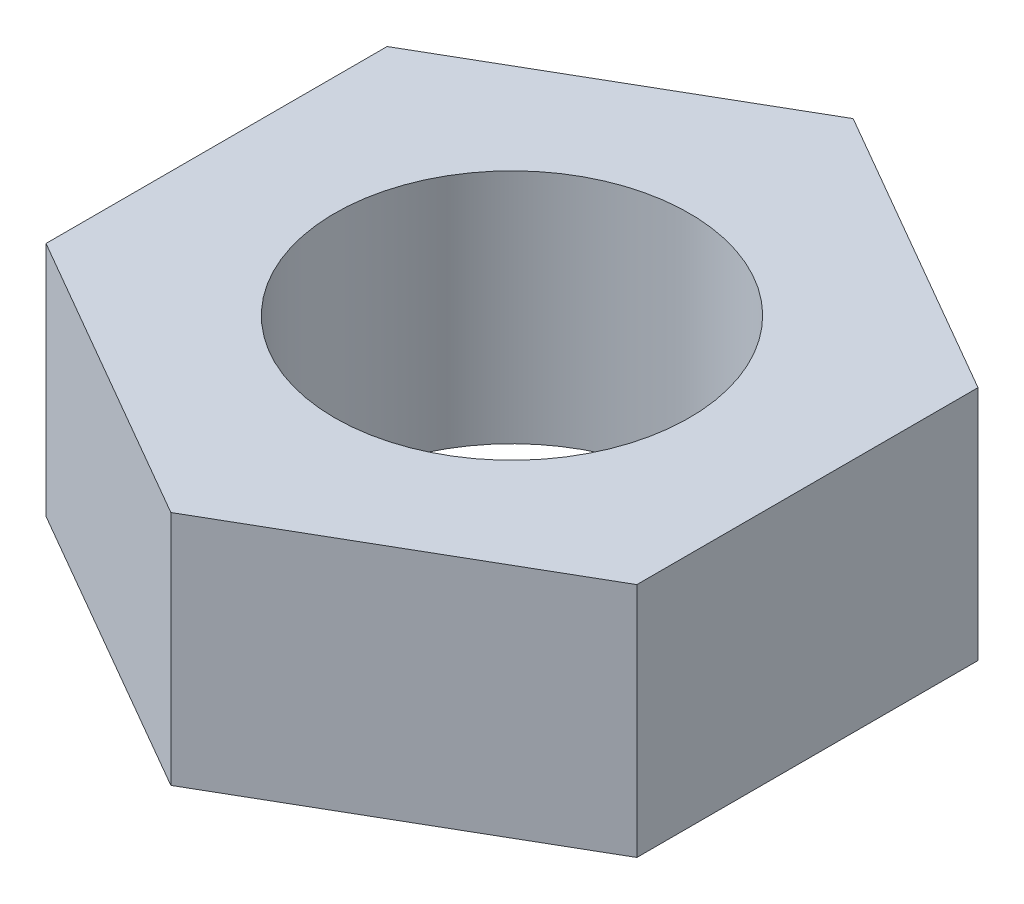
ISO-10303-21;
HEADER;
FILE_DESCRIPTION(('STEP AP214'),'2;1');
FILE_NAME('part.step','',(''),(''),'','','');
FILE_SCHEMA(('AUTOMOTIVE_DESIGN { 1 0 10303 214 1 1 1 1 }'));
ENDSEC;
DATA;
#1=APPLICATION_CONTEXT('core data for automotive mechanical design processes');
#2=APPLICATION_PROTOCOL_DEFINITION('international standard','automotive_design',2000,#1);
#3=PRODUCT_CONTEXT('',#1,'mechanical');
#4=PRODUCT('Part','Part','',(#3));
#5=PRODUCT_RELATED_PRODUCT_CATEGORY('part','',(#4));
#6=PRODUCT_DEFINITION_FORMATION('','',#4);
#7=PRODUCT_DEFINITION_CONTEXT('part definition',#1,'design');
#8=PRODUCT_DEFINITION('design','',#6,#7);
#9=PRODUCT_DEFINITION_SHAPE('','',#8);
#10=(LENGTH_UNIT() NAMED_UNIT(*) SI_UNIT(.MILLI.,.METRE.));
#11=(NAMED_UNIT(*) PLANE_ANGLE_UNIT() SI_UNIT($,.RADIAN.));
#12=(NAMED_UNIT(*) SI_UNIT($,.STERADIAN.) SOLID_ANGLE_UNIT());
#13=UNCERTAINTY_MEASURE_WITH_UNIT(LENGTH_MEASURE(1.E-05),#10,'distance_accuracy_value','');
#14=(GEOMETRIC_REPRESENTATION_CONTEXT(3) GLOBAL_UNCERTAINTY_ASSIGNED_CONTEXT((#13)) GLOBAL_UNIT_ASSIGNED_CONTEXT((#10,
#11,#12)) REPRESENTATION_CONTEXT('',''));
#15=CARTESIAN_POINT('',(0.,0.,0.));
#16=DIRECTION('',(0.,0.,1.));
#17=DIRECTION('',(1.,0.,0.));
#18=AXIS2_PLACEMENT_3D('',#15,#16,#17);
#19=CARTESIAN_POINT('',(0.,2.,0.));
#20=DIRECTION('',(0.,1.,0.));
#21=DIRECTION('',(0.,0.,1.));
#22=AXIS2_PLACEMENT_3D('',#19,#20,#21);
#23=PLANE('',#22);
#24=DIRECTION('',(-0.866025403784439,0.,-0.5));
#25=VECTOR('',#24,1.);
#26=CARTESIAN_POINT('',(2.5,2.,-1.44337567297407));
#27=LINE('',#26,#25);
#28=CARTESIAN_POINT('',(2.5,2.,-1.44337567297407));
#29=VERTEX_POINT('',#28);
#30=CARTESIAN_POINT('',(0.,2.,-2.88675134594813));
#31=VERTEX_POINT('',#30);
#32=EDGE_CURVE('E149',#29,#31,#27,.T.);
#33=ORIENTED_EDGE('',*,*,#32,.T.);
#34=DIRECTION('',(-0.866025403784438,0.,0.5));
#35=VECTOR('',#34,1.);
#36=CARTESIAN_POINT('',(0.,2.,-2.88675134594813));
#37=LINE('',#36,#35);
#38=CARTESIAN_POINT('',(-2.5,2.,-1.44337567297406));
#39=VERTEX_POINT('',#38);
#40=EDGE_CURVE('E97',#31,#39,#37,.T.);
#41=ORIENTED_EDGE('',*,*,#40,.T.);
#42=DIRECTION('',(0.,0.,1.));
#43=VECTOR('',#42,1.);
#44=CARTESIAN_POINT('',(-2.5,2.,-1.44337567297406));
#45=LINE('',#44,#43);
#46=CARTESIAN_POINT('',(-2.5,2.,1.44337567297406));
#47=VERTEX_POINT('',#46);
#48=EDGE_CURVE('E110',#39,#47,#45,.T.);
#49=ORIENTED_EDGE('',*,*,#48,.T.);
#50=DIRECTION('',(0.866025403784439,0.,0.5));
#51=VECTOR('',#50,1.);
#52=CARTESIAN_POINT('',(-2.5,2.,1.44337567297406));
#53=LINE('',#52,#51);
#54=CARTESIAN_POINT('',(0.,2.,2.88675134594813));
#55=VERTEX_POINT('',#54);
#56=EDGE_CURVE('E104',#47,#55,#53,.T.);
#57=ORIENTED_EDGE('',*,*,#56,.T.);
#58=DIRECTION('',(0.866025403784439,0.,-0.5));
#59=VECTOR('',#58,1.);
#60=CARTESIAN_POINT('',(0.,2.,2.88675134594813));
#61=LINE('',#60,#59);
#62=CARTESIAN_POINT('',(2.5,2.,1.44337567297406));
#63=VERTEX_POINT('',#62);
#64=EDGE_CURVE('E108',#55,#63,#61,.T.);
#65=ORIENTED_EDGE('',*,*,#64,.T.);
#66=DIRECTION('',(0.,0.,-1.));
#67=VECTOR('',#66,1.);
#68=CARTESIAN_POINT('',(2.5,2.,1.44337567297406));
#69=LINE('',#68,#67);
#70=EDGE_CURVE('E60',#63,#29,#69,.T.);
#71=ORIENTED_EDGE('',*,*,#70,.T.);
#72=EDGE_LOOP('',(#33,#41,#49,#57,#65,#71));
#73=FACE_BOUND('',#72,.T.);
#74=CARTESIAN_POINT('',(0.,2.,0.));
#75=DIRECTION('',(0.,1.,0.));
#76=DIRECTION('',(0.,0.,1.));
#77=AXIS2_PLACEMENT_3D('',#74,#75,#76);
#78=CIRCLE('',#77,1.5);
#79=CARTESIAN_POINT('',(0.,2.,1.5));
#80=VERTEX_POINT('',#79);
#81=EDGE_CURVE('E137',#80,#80,#78,.T.);
#82=ORIENTED_EDGE('',*,*,#81,.F.);
#83=EDGE_LOOP('',(#82));
#84=FACE_BOUND('',#83,.T.);
#85=ADVANCED_FACE('F42',(#73,#84),#23,.T.);
#86=CARTESIAN_POINT('',(0.,0.,0.));
#87=DIRECTION('',(0.,1.,0.));
#88=DIRECTION('',(0.,0.,1.));
#89=AXIS2_PLACEMENT_3D('',#86,#87,#88);
#90=PLANE('',#89);
#91=DIRECTION('',(-0.866025403784439,0.,-0.5));
#92=VECTOR('',#91,1.);
#93=CARTESIAN_POINT('',(2.5,0.,-1.44337567297407));
#94=LINE('',#93,#92);
#95=CARTESIAN_POINT('',(2.5,0.,-1.44337567297407));
#96=VERTEX_POINT('',#95);
#97=CARTESIAN_POINT('',(0.,0.,-2.88675134594813));
#98=VERTEX_POINT('',#97);
#99=EDGE_CURVE('E132',#96,#98,#94,.T.);
#100=ORIENTED_EDGE('',*,*,#99,.F.);
#101=DIRECTION('',(0.,0.,-1.));
#102=VECTOR('',#101,1.);
#103=CARTESIAN_POINT('',(2.5,0.,1.44337567297406));
#104=LINE('',#103,#102);
#105=CARTESIAN_POINT('',(2.5,0.,1.44337567297406));
#106=VERTEX_POINT('',#105);
#107=EDGE_CURVE('E89',#106,#96,#104,.T.);
#108=ORIENTED_EDGE('',*,*,#107,.F.);
#109=DIRECTION('',(0.866025403784439,0.,-0.5));
#110=VECTOR('',#109,1.);
#111=CARTESIAN_POINT('',(0.,0.,2.88675134594813));
#112=LINE('',#111,#110);
#113=CARTESIAN_POINT('',(0.,0.,2.88675134594813));
#114=VERTEX_POINT('',#113);
#115=EDGE_CURVE('E83',#114,#106,#112,.T.);
#116=ORIENTED_EDGE('',*,*,#115,.F.);
#117=DIRECTION('',(0.866025403784439,0.,0.5));
#118=VECTOR('',#117,1.);
#119=CARTESIAN_POINT('',(-2.5,0.,1.44337567297406));
#120=LINE('',#119,#118);
#121=CARTESIAN_POINT('',(-2.5,0.,1.44337567297406));
#122=VERTEX_POINT('',#121);
#123=EDGE_CURVE('E119',#122,#114,#120,.T.);
#124=ORIENTED_EDGE('',*,*,#123,.F.);
#125=DIRECTION('',(0.,0.,1.));
#126=VECTOR('',#125,1.);
#127=CARTESIAN_POINT('',(-2.5,0.,-1.44337567297406));
#128=LINE('',#127,#126);
#129=CARTESIAN_POINT('',(-2.5,0.,-1.44337567297406));
#130=VERTEX_POINT('',#129);
#131=EDGE_CURVE('E140',#130,#122,#128,.T.);
#132=ORIENTED_EDGE('',*,*,#131,.F.);
#133=DIRECTION('',(-0.866025403784438,0.,0.5));
#134=VECTOR('',#133,1.);
#135=CARTESIAN_POINT('',(0.,0.,-2.88675134594813));
#136=LINE('',#135,#134);
#137=EDGE_CURVE('E136',#98,#130,#136,.T.);
#138=ORIENTED_EDGE('',*,*,#137,.F.);
#139=EDGE_LOOP('',(#100,#108,#116,#124,#132,#138));
#140=FACE_BOUND('',#139,.T.);
#141=CARTESIAN_POINT('',(0.,0.,0.));
#142=DIRECTION('',(0.,1.,0.));
#143=DIRECTION('',(0.,0.,1.));
#144=AXIS2_PLACEMENT_3D('',#141,#142,#143);
#145=CIRCLE('',#144,1.5);
#146=CARTESIAN_POINT('',(0.,0.,1.5));
#147=VERTEX_POINT('',#146);
#148=EDGE_CURVE('E248',#147,#147,#145,.T.);
#149=ORIENTED_EDGE('',*,*,#148,.T.);
#150=EDGE_LOOP('',(#149));
#151=FACE_BOUND('',#150,.T.);
#152=ADVANCED_FACE('F162',(#140,#151),#90,.F.);
#153=CARTESIAN_POINT('',(2.5,2.,-1.44337567297407));
#154=DIRECTION('',(-0.5,0.,0.866025403784439));
#155=DIRECTION('',(0.866025403784439,0.,0.5));
#156=AXIS2_PLACEMENT_3D('',#153,#154,#155);
#157=PLANE('',#156);
#158=ORIENTED_EDGE('',*,*,#99,.T.);
#159=DIRECTION('',(0.,-1.,0.));
#160=VECTOR('',#159,1.);
#161=CARTESIAN_POINT('',(0.,2.,-2.88675134594813));
#162=LINE('',#161,#160);
#163=EDGE_CURVE('E11',#31,#98,#162,.T.);
#164=ORIENTED_EDGE('',*,*,#163,.F.);
#165=ORIENTED_EDGE('',*,*,#32,.F.);
#166=DIRECTION('',(0.,-1.,0.));
#167=VECTOR('',#166,1.);
#168=CARTESIAN_POINT('',(2.5,2.,-1.44337567297407));
#169=LINE('',#168,#167);
#170=EDGE_CURVE('E128',#29,#96,#169,.T.);
#171=ORIENTED_EDGE('',*,*,#170,.T.);
#172=EDGE_LOOP('',(#158,#164,#165,#171));
#173=FACE_BOUND('',#172,.T.);
#174=ADVANCED_FACE('F44',(#173),#157,.F.);
#175=CARTESIAN_POINT('',(0.,2.,-2.88675134594813));
#176=DIRECTION('',(0.5,0.,0.866025403784438));
#177=DIRECTION('',(0.866025403784439,0.,-0.5));
#178=AXIS2_PLACEMENT_3D('',#175,#176,#177);
#179=PLANE('',#178);
#180=ORIENTED_EDGE('',*,*,#137,.T.);
#181=DIRECTION('',(0.,-1.,0.));
#182=VECTOR('',#181,1.);
#183=CARTESIAN_POINT('',(-2.5,2.,-1.44337567297406));
#184=LINE('',#183,#182);
#185=EDGE_CURVE('E52',#39,#130,#184,.T.);
#186=ORIENTED_EDGE('',*,*,#185,.F.);
#187=ORIENTED_EDGE('',*,*,#40,.F.);
#188=ORIENTED_EDGE('',*,*,#163,.T.);
#189=EDGE_LOOP('',(#180,#186,#187,#188));
#190=FACE_BOUND('',#189,.T.);
#191=ADVANCED_FACE('F187',(#190),#179,.F.);
#192=CARTESIAN_POINT('',(-2.5,2.,-1.44337567297406));
#193=DIRECTION('',(1.,0.,0.));
#194=DIRECTION('',(0.,0.,-1.));
#195=AXIS2_PLACEMENT_3D('',#192,#193,#194);
#196=PLANE('',#195);
#197=ORIENTED_EDGE('',*,*,#131,.T.);
#198=DIRECTION('',(0.,-1.,0.));
#199=VECTOR('',#198,1.);
#200=CARTESIAN_POINT('',(-2.5,2.,1.44337567297406));
#201=LINE('',#200,#199);
#202=EDGE_CURVE('E121',#47,#122,#201,.T.);
#203=ORIENTED_EDGE('',*,*,#202,.F.);
#204=ORIENTED_EDGE('',*,*,#48,.F.);
#205=ORIENTED_EDGE('',*,*,#185,.T.);
#206=EDGE_LOOP('',(#197,#203,#204,#205));
#207=FACE_BOUND('',#206,.T.);
#208=ADVANCED_FACE('F159',(#207),#196,.F.);
#209=CARTESIAN_POINT('',(-2.5,2.,1.44337567297406));
#210=DIRECTION('',(0.5,0.,-0.866025403784439));
#211=DIRECTION('',(-0.866025403784439,0.,-0.5));
#212=AXIS2_PLACEMENT_3D('',#209,#210,#211);
#213=PLANE('',#212);
#214=ORIENTED_EDGE('',*,*,#123,.T.);
#215=DIRECTION('',(0.,-1.,0.));
#216=VECTOR('',#215,1.);
#217=CARTESIAN_POINT('',(0.,2.,2.88675134594813));
#218=LINE('',#217,#216);
#219=EDGE_CURVE('E116',#55,#114,#218,.T.);
#220=ORIENTED_EDGE('',*,*,#219,.F.);
#221=ORIENTED_EDGE('',*,*,#56,.F.);
#222=ORIENTED_EDGE('',*,*,#202,.T.);
#223=EDGE_LOOP('',(#214,#220,#221,#222));
#224=FACE_BOUND('',#223,.T.);
#225=ADVANCED_FACE('F117',(#224),#213,.F.);
#226=CARTESIAN_POINT('',(0.,2.,2.88675134594813));
#227=DIRECTION('',(-0.5,0.,-0.866025403784439));
#228=DIRECTION('',(-0.866025403784439,0.,0.5));
#229=AXIS2_PLACEMENT_3D('',#226,#227,#228);
#230=PLANE('',#229);
#231=ORIENTED_EDGE('',*,*,#115,.T.);
#232=DIRECTION('',(0.,-1.,0.));
#233=VECTOR('',#232,1.);
#234=CARTESIAN_POINT('',(2.5,2.,1.44337567297406));
#235=LINE('',#234,#233);
#236=EDGE_CURVE('E122',#63,#106,#235,.T.);
#237=ORIENTED_EDGE('',*,*,#236,.F.);
#238=ORIENTED_EDGE('',*,*,#64,.F.);
#239=ORIENTED_EDGE('',*,*,#219,.T.);
#240=EDGE_LOOP('',(#231,#237,#238,#239));
#241=FACE_BOUND('',#240,.T.);
#242=ADVANCED_FACE('F124',(#241),#230,.F.);
#243=CARTESIAN_POINT('',(2.5,2.,1.44337567297406));
#244=DIRECTION('',(-1.,0.,0.));
#245=DIRECTION('',(0.,0.,1.));
#246=AXIS2_PLACEMENT_3D('',#243,#244,#245);
#247=PLANE('',#246);
#248=ORIENTED_EDGE('',*,*,#107,.T.);
#249=ORIENTED_EDGE('',*,*,#170,.F.);
#250=ORIENTED_EDGE('',*,*,#70,.F.);
#251=ORIENTED_EDGE('',*,*,#236,.T.);
#252=EDGE_LOOP('',(#248,#249,#250,#251));
#253=FACE_BOUND('',#252,.T.);
#254=ADVANCED_FACE('F167',(#253),#247,.F.);
#255=CARTESIAN_POINT('',(0.,2.,0.));
#256=DIRECTION('',(0.,-1.,0.));
#257=DIRECTION('',(0.,0.,-1.));
#258=AXIS2_PLACEMENT_3D('',#255,#256,#257);
#259=CYLINDRICAL_SURFACE('',#258,1.5);
#260=ORIENTED_EDGE('',*,*,#81,.T.);
#261=EDGE_LOOP('',(#260));
#262=FACE_BOUND('',#261,.T.);
#263=ORIENTED_EDGE('',*,*,#148,.F.);
#264=EDGE_LOOP('',(#263));
#265=FACE_BOUND('',#264,.T.);
#266=ADVANCED_FACE('F169',(#262,#265),#259,.F.);
#267=CLOSED_SHELL('',(#85,#152,#174,#191,#208,#225,#242,#254,#266));
#268=MANIFOLD_SOLID_BREP('B2',#267);
#269=ADVANCED_BREP_SHAPE_REPRESENTATION('',(#18,#268),#14);
#270=SHAPE_DEFINITION_REPRESENTATION(#9,#269);
ENDSEC;
END-ISO-10303-21;
